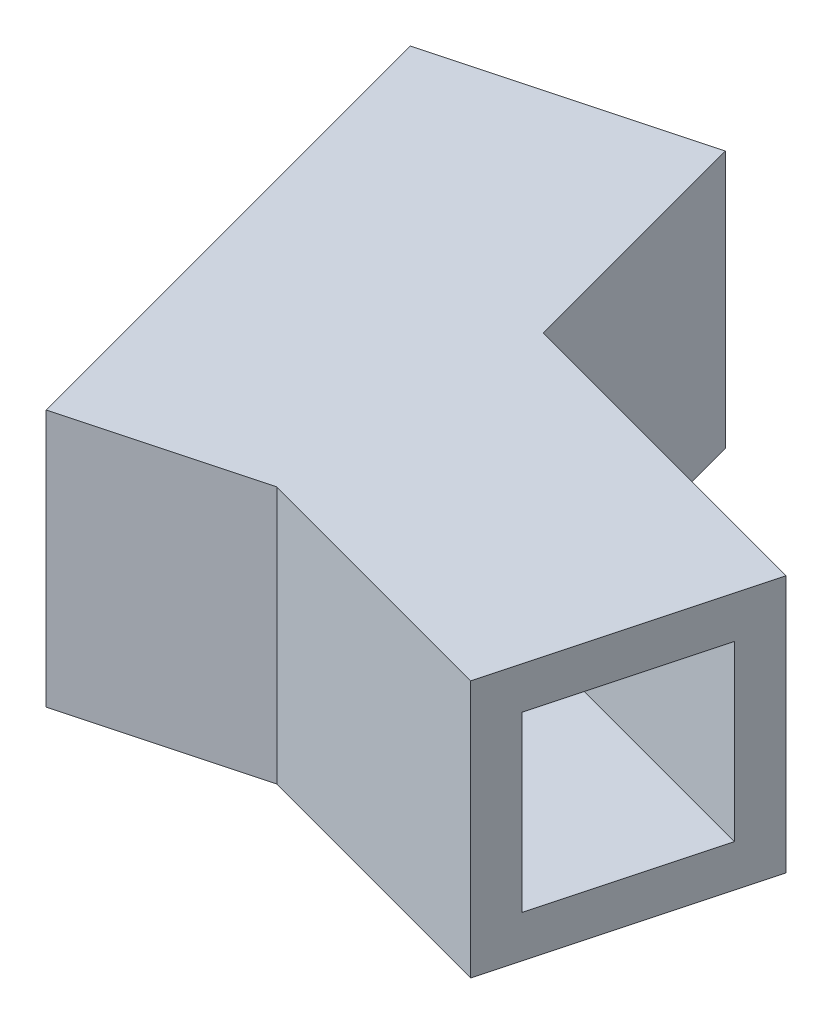
ISO-10303-21;
HEADER;
FILE_DESCRIPTION(('STEP AP214'),'2;1');
FILE_NAME('part.step','',(''),(''),'','','');
FILE_SCHEMA(('AUTOMOTIVE_DESIGN { 1 0 10303 214 1 1 1 1 }'));
ENDSEC;
DATA;
#1=APPLICATION_CONTEXT('core data for automotive mechanical design processes');
#2=APPLICATION_PROTOCOL_DEFINITION('international standard','automotive_design',2000,#1);
#3=PRODUCT_CONTEXT('',#1,'mechanical');
#4=PRODUCT('Part','Part','',(#3));
#5=PRODUCT_RELATED_PRODUCT_CATEGORY('part','',(#4));
#6=PRODUCT_DEFINITION_FORMATION('','',#4);
#7=PRODUCT_DEFINITION_CONTEXT('part definition',#1,'design');
#8=PRODUCT_DEFINITION('design','',#6,#7);
#9=PRODUCT_DEFINITION_SHAPE('','',#8);
#10=(LENGTH_UNIT() NAMED_UNIT(*) SI_UNIT(.MILLI.,.METRE.));
#11=(NAMED_UNIT(*) PLANE_ANGLE_UNIT() SI_UNIT($,.RADIAN.));
#12=(NAMED_UNIT(*) SI_UNIT($,.STERADIAN.) SOLID_ANGLE_UNIT());
#13=UNCERTAINTY_MEASURE_WITH_UNIT(LENGTH_MEASURE(1.E-05),#10,'distance_accuracy_value','');
#14=(GEOMETRIC_REPRESENTATION_CONTEXT(3) GLOBAL_UNCERTAINTY_ASSIGNED_CONTEXT((#13)) GLOBAL_UNIT_ASSIGNED_CONTEXT((#10,
#11,#12)) REPRESENTATION_CONTEXT('',''));
#15=CARTESIAN_POINT('',(0.,0.,0.));
#16=DIRECTION('',(0.,0.,1.));
#17=DIRECTION('',(1.,0.,0.));
#18=AXIS2_PLACEMENT_3D('',#15,#16,#17);
#19=CARTESIAN_POINT('',(-3.88228567653782,15.,-30.0180301004873));
#20=DIRECTION('',(0.258819045102521,0.,0.965925826289068));
#21=DIRECTION('',(0.965925826289068,0.,-0.258819045102521));
#22=AXIS2_PLACEMENT_3D('',#19,#20,#21);
#23=PLANE('',#22);
#24=DIRECTION('',(0.965925826289068,0.,-0.258819045102521));
#25=VECTOR('',#24,1.);
#26=CARTESIAN_POINT('',(-6.24880395094603,12.55,-29.3839234399861));
#27=LINE('',#26,#25);
#28=CARTESIAN_POINT('',(-16.0046547964656,12.55,-26.7698510844506));
#29=VERTEX_POINT('',#28);
#30=CARTESIAN_POINT('',(-6.24880395094603,12.55,-29.3839234399861));
#31=VERTEX_POINT('',#30);
#32=EDGE_CURVE('E284',#29,#31,#27,.T.);
#33=ORIENTED_EDGE('',*,*,#32,.F.);
#34=DIRECTION('',(0.,1.,0.));
#35=VECTOR('',#34,1.);
#36=CARTESIAN_POINT('',(-16.0046547964656,12.55,-26.7698510844506));
#37=LINE('',#36,#35);
#38=CARTESIAN_POINT('',(-16.0046547964656,2.45,-26.7698510844506));
#39=VERTEX_POINT('',#38);
#40=EDGE_CURVE('E263',#39,#29,#37,.T.);
#41=ORIENTED_EDGE('',*,*,#40,.F.);
#42=DIRECTION('',(-0.965925826289068,0.,0.258819045102521));
#43=VECTOR('',#42,1.);
#44=CARTESIAN_POINT('',(-6.24880395094603,2.45,-29.3839234399861));
#45=LINE('',#44,#43);
#46=CARTESIAN_POINT('',(-6.24880395094603,2.45,-29.3839234399861));
#47=VERTEX_POINT('',#46);
#48=EDGE_CURVE('E290',#47,#39,#45,.T.);
#49=ORIENTED_EDGE('',*,*,#48,.F.);
#50=DIRECTION('',(0.,-1.,0.));
#51=VECTOR('',#50,1.);
#52=CARTESIAN_POINT('',(-6.24880395094603,12.55,-29.3839234399861));
#53=LINE('',#52,#51);
#54=EDGE_CURVE('E287',#31,#47,#53,.T.);
#55=ORIENTED_EDGE('',*,*,#54,.F.);
#56=EDGE_LOOP('',(#33,#41,#49,#55));
#57=FACE_BOUND('',#56,.T.);
#58=DIRECTION('',(-0.965925826289068,0.,0.258819045102521));
#59=VECTOR('',#58,1.);
#60=CARTESIAN_POINT('',(-3.88228567653782,0.,-30.0180301004873));
#61=LINE('',#60,#59);
#62=CARTESIAN_POINT('',(-3.88228567653782,0.,-30.0180301004873));
#63=VERTEX_POINT('',#62);
#64=CARTESIAN_POINT('',(-18.3711730708738,0.,-26.1357444239495));
#65=VERTEX_POINT('',#64);
#66=EDGE_CURVE('E327',#63,#65,#61,.T.);
#67=ORIENTED_EDGE('',*,*,#66,.T.);
#68=DIRECTION('',(0.,-1.,0.));
#69=VECTOR('',#68,1.);
#70=CARTESIAN_POINT('',(-18.3711730708738,15.,-26.1357444239495));
#71=LINE('',#70,#69);
#72=CARTESIAN_POINT('',(-18.3711730708738,15.,-26.1357444239495));
#73=VERTEX_POINT('',#72);
#74=EDGE_CURVE('E381',#73,#65,#71,.T.);
#75=ORIENTED_EDGE('',*,*,#74,.F.);
#76=DIRECTION('',(-0.965925826289068,0.,0.258819045102521));
#77=VECTOR('',#76,1.);
#78=CARTESIAN_POINT('',(-3.88228567653782,15.,-30.0180301004873));
#79=LINE('',#78,#77);
#80=CARTESIAN_POINT('',(-3.88228567653782,15.,-30.0180301004873));
#81=VERTEX_POINT('',#80);
#82=EDGE_CURVE('E334',#81,#73,#79,.T.);
#83=ORIENTED_EDGE('',*,*,#82,.F.);
#84=DIRECTION('',(0.,-1.,0.));
#85=VECTOR('',#84,1.);
#86=CARTESIAN_POINT('',(-3.88228567653782,15.,-30.0180301004873));
#87=LINE('',#86,#85);
#88=EDGE_CURVE('E350',#81,#63,#87,.T.);
#89=ORIENTED_EDGE('',*,*,#88,.T.);
#90=EDGE_LOOP('',(#67,#75,#83,#89));
#91=FACE_BOUND('',#90,.T.);
#92=ADVANCED_FACE('F36',(#57,#91),#23,.F.);
#93=CARTESIAN_POINT('',(-18.3711730708738,15.,-26.1357444239495));
#94=DIRECTION('',(0.965925826289068,0.,-0.258819045102522));
#95=DIRECTION('',(-0.258819045102522,0.,-0.965925826289068));
#96=AXIS2_PLACEMENT_3D('',#93,#94,#95);
#97=PLANE('',#96);
#98=DIRECTION('',(0.258819045102522,0.,0.965925826289068));
#99=VECTOR('',#98,1.);
#100=CARTESIAN_POINT('',(-18.3711730708738,0.,-26.1357444239495));
#101=LINE('',#100,#99);
#102=CARTESIAN_POINT('',(-10.6066017177982,0.,2.84203036472259));
#103=VERTEX_POINT('',#102);
#104=EDGE_CURVE('E353',#65,#103,#101,.T.);
#105=ORIENTED_EDGE('',*,*,#104,.T.);
#106=DIRECTION('',(0.,-1.,0.));
#107=VECTOR('',#106,1.);
#108=CARTESIAN_POINT('',(-10.6066017177982,15.,2.84203036472259));
#109=LINE('',#108,#107);
#110=CARTESIAN_POINT('',(-10.6066017177982,15.,2.84203036472259));
#111=VERTEX_POINT('',#110);
#112=EDGE_CURVE('E378',#111,#103,#109,.T.);
#113=ORIENTED_EDGE('',*,*,#112,.F.);
#114=DIRECTION('',(0.258819045102522,0.,0.965925826289068));
#115=VECTOR('',#114,1.);
#116=CARTESIAN_POINT('',(-18.3711730708738,15.,-26.1357444239495));
#117=LINE('',#116,#115);
#118=EDGE_CURVE('E337',#73,#111,#117,.T.);
#119=ORIENTED_EDGE('',*,*,#118,.F.);
#120=ORIENTED_EDGE('',*,*,#74,.T.);
#121=EDGE_LOOP('',(#105,#113,#119,#120));
#122=FACE_BOUND('',#121,.T.);
#123=ADVANCED_FACE('F469',(#122),#97,.F.);
#124=CARTESIAN_POINT('',(-10.6066017177982,15.,2.84203036472259));
#125=DIRECTION('',(-0.258819045102521,0.,-0.965925826289068));
#126=DIRECTION('',(-0.965925826289068,0.,0.258819045102521));
#127=AXIS2_PLACEMENT_3D('',#124,#125,#126);
#128=PLANE('',#127);
#129=DIRECTION('',(0.965925826289068,0.,-0.258819045102521));
#130=VECTOR('',#129,1.);
#131=CARTESIAN_POINT('',(-10.6066017177982,0.,2.84203036472259));
#132=LINE('',#131,#130);
#133=CARTESIAN_POINT('',(0.,0.,0.));
#134=VERTEX_POINT('',#133);
#135=EDGE_CURVE('E355',#103,#134,#132,.T.);
#136=ORIENTED_EDGE('',*,*,#135,.T.);
#137=DIRECTION('',(0.,-1.,0.));
#138=VECTOR('',#137,1.);
#139=CARTESIAN_POINT('',(0.,15.,0.));
#140=LINE('',#139,#138);
#141=CARTESIAN_POINT('',(0.,15.,0.));
#142=VERTEX_POINT('',#141);
#143=EDGE_CURVE('E375',#142,#134,#140,.T.);
#144=ORIENTED_EDGE('',*,*,#143,.F.);
#145=DIRECTION('',(0.965925826289068,0.,-0.258819045102521));
#146=VECTOR('',#145,1.);
#147=CARTESIAN_POINT('',(-10.6066017177982,15.,2.84203036472259));
#148=LINE('',#147,#146);
#149=EDGE_CURVE('E340',#111,#142,#148,.T.);
#150=ORIENTED_EDGE('',*,*,#149,.F.);
#151=ORIENTED_EDGE('',*,*,#112,.T.);
#152=EDGE_LOOP('',(#136,#144,#150,#151));
#153=FACE_BOUND('',#152,.T.);
#154=ADVANCED_FACE('F475',(#153),#128,.F.);
#155=CARTESIAN_POINT('',(0.,15.,0.));
#156=DIRECTION('',(0.258819045102521,0.,-0.965925826289068));
#157=DIRECTION('',(-0.965925826289068,0.,-0.258819045102521));
#158=AXIS2_PLACEMENT_3D('',#155,#156,#157);
#159=PLANE('',#158);
#160=DIRECTION('',(0.965925826289068,0.,0.258819045102521));
#161=VECTOR('',#160,1.);
#162=CARTESIAN_POINT('',(0.,0.,0.));
#163=LINE('',#162,#161);
#164=CARTESIAN_POINT('',(15.4362308492435,0.,4.1361255902352));
#165=VERTEX_POINT('',#164);
#166=EDGE_CURVE('E357',#134,#165,#163,.T.);
#167=ORIENTED_EDGE('',*,*,#166,.T.);
#168=DIRECTION('',(0.,-1.,0.));
#169=VECTOR('',#168,1.);
#170=CARTESIAN_POINT('',(15.4362308492435,15.,4.1361255902352));
#171=LINE('',#170,#169);
#172=CARTESIAN_POINT('',(15.4362308492435,15.,4.1361255902352));
#173=VERTEX_POINT('',#172);
#174=EDGE_CURVE('E372',#173,#165,#171,.T.);
#175=ORIENTED_EDGE('',*,*,#174,.F.);
#176=DIRECTION('',(0.965925826289068,0.,0.258819045102521));
#177=VECTOR('',#176,1.);
#178=CARTESIAN_POINT('',(0.,15.,0.));
#179=LINE('',#178,#177);
#180=EDGE_CURVE('E342',#142,#173,#179,.T.);
#181=ORIENTED_EDGE('',*,*,#180,.F.);
#182=ORIENTED_EDGE('',*,*,#143,.T.);
#183=EDGE_LOOP('',(#167,#175,#181,#182));
#184=FACE_BOUND('',#183,.T.);
#185=ADVANCED_FACE('F721',(#184),#159,.F.);
#186=CARTESIAN_POINT('',(15.4362308492435,15.,4.1361255902352));
#187=DIRECTION('',(-0.965925826289068,0.,-0.258819045102521));
#188=DIRECTION('',(-0.258819045102521,0.,0.965925826289068));
#189=AXIS2_PLACEMENT_3D('',#186,#187,#188);
#190=PLANE('',#189);
#191=DIRECTION('',(-0.258819045102522,0.,0.965925826289068));
#192=VECTOR('',#191,1.);
#193=CARTESIAN_POINT('',(16.0703375097447,12.55,1.76960731582699));
#194=LINE('',#193,#192);
#195=CARTESIAN_POINT('',(18.6844098652802,12.55,-7.98624352969259));
#196=VERTEX_POINT('',#195);
#197=CARTESIAN_POINT('',(16.0703375097447,12.55,1.76960731582699));
#198=VERTEX_POINT('',#197);
#199=EDGE_CURVE('E317',#196,#198,#194,.T.);
#200=ORIENTED_EDGE('',*,*,#199,.F.);
#201=DIRECTION('',(0.,1.,0.));
#202=VECTOR('',#201,1.);
#203=CARTESIAN_POINT('',(18.6844098652802,2.45,-7.9862435296926));
#204=LINE('',#203,#202);
#205=CARTESIAN_POINT('',(18.6844098652802,2.45,-7.9862435296926));
#206=VERTEX_POINT('',#205);
#207=EDGE_CURVE('E295',#206,#196,#204,.T.);
#208=ORIENTED_EDGE('',*,*,#207,.F.);
#209=DIRECTION('',(0.258819045102522,0.,-0.965925826289068));
#210=VECTOR('',#209,1.);
#211=CARTESIAN_POINT('',(16.0703375097447,2.45,1.76960731582699));
#212=LINE('',#211,#210);
#213=CARTESIAN_POINT('',(16.0703375097447,2.45,1.76960731582699));
#214=VERTEX_POINT('',#213);
#215=EDGE_CURVE('E306',#214,#206,#212,.T.);
#216=ORIENTED_EDGE('',*,*,#215,.F.);
#217=DIRECTION('',(0.,-1.,0.));
#218=VECTOR('',#217,1.);
#219=CARTESIAN_POINT('',(16.0703375097447,2.45,1.76960731582699));
#220=LINE('',#219,#218);
#221=EDGE_CURVE('E320',#198,#214,#220,.T.);
#222=ORIENTED_EDGE('',*,*,#221,.F.);
#223=EDGE_LOOP('',(#200,#208,#216,#222));
#224=FACE_BOUND('',#223,.T.);
#225=DIRECTION('',(0.258819045102521,0.,-0.965925826289068));
#226=VECTOR('',#225,1.);
#227=CARTESIAN_POINT('',(15.4362308492435,0.,4.1361255902352));
#228=LINE('',#227,#226);
#229=CARTESIAN_POINT('',(19.3185165257814,0.,-10.3527618041008));
#230=VERTEX_POINT('',#229);
#231=EDGE_CURVE('E359',#165,#230,#228,.T.);
#232=ORIENTED_EDGE('',*,*,#231,.T.);
#233=DIRECTION('',(0.,-1.,0.));
#234=VECTOR('',#233,1.);
#235=CARTESIAN_POINT('',(19.3185165257814,15.,-10.3527618041008));
#236=LINE('',#235,#234);
#237=CARTESIAN_POINT('',(19.3185165257814,15.,-10.3527618041008));
#238=VERTEX_POINT('',#237);
#239=EDGE_CURVE('E369',#238,#230,#236,.T.);
#240=ORIENTED_EDGE('',*,*,#239,.F.);
#241=DIRECTION('',(0.258819045102521,0.,-0.965925826289068));
#242=VECTOR('',#241,1.);
#243=CARTESIAN_POINT('',(15.4362308492435,15.,4.1361255902352));
#244=LINE('',#243,#242);
#245=EDGE_CURVE('E344',#173,#238,#244,.T.);
#246=ORIENTED_EDGE('',*,*,#245,.F.);
#247=ORIENTED_EDGE('',*,*,#174,.T.);
#248=EDGE_LOOP('',(#232,#240,#246,#247));
#249=FACE_BOUND('',#248,.T.);
#250=ADVANCED_FACE('F713',(#224,#249),#190,.F.);
#251=CARTESIAN_POINT('',(19.3185165257814,15.,-10.3527618041008));
#252=DIRECTION('',(-0.258819045102521,0.,0.965925826289068));
#253=DIRECTION('',(0.965925826289068,0.,0.258819045102521));
#254=AXIS2_PLACEMENT_3D('',#251,#252,#253);
#255=PLANE('',#254);
#256=DIRECTION('',(-0.965925826289068,0.,-0.258819045102522));
#257=VECTOR('',#256,1.);
#258=CARTESIAN_POINT('',(19.3185165257814,0.,-10.3527618041008));
#259=LINE('',#258,#257);
#260=CARTESIAN_POINT('',(0.,0.,-15.5291427061513));
#261=VERTEX_POINT('',#260);
#262=EDGE_CURVE('E361',#230,#261,#259,.T.);
#263=ORIENTED_EDGE('',*,*,#262,.T.);
#264=DIRECTION('',(0.,-1.,0.));
#265=VECTOR('',#264,1.);
#266=CARTESIAN_POINT('',(0.,15.,-15.5291427061513));
#267=LINE('',#266,#265);
#268=CARTESIAN_POINT('',(0.,15.,-15.5291427061513));
#269=VERTEX_POINT('',#268);
#270=EDGE_CURVE('E366',#269,#261,#267,.T.);
#271=ORIENTED_EDGE('',*,*,#270,.F.);
#272=DIRECTION('',(-0.965925826289068,0.,-0.258819045102522));
#273=VECTOR('',#272,1.);
#274=CARTESIAN_POINT('',(19.3185165257814,15.,-10.3527618041008));
#275=LINE('',#274,#273);
#276=EDGE_CURVE('E346',#238,#269,#275,.T.);
#277=ORIENTED_EDGE('',*,*,#276,.F.);
#278=ORIENTED_EDGE('',*,*,#239,.T.);
#279=EDGE_LOOP('',(#263,#271,#277,#278));
#280=FACE_BOUND('',#279,.T.);
#281=ADVANCED_FACE('F705',(#280),#255,.F.);
#282=CARTESIAN_POINT('',(0.,15.,-15.5291427061513));
#283=DIRECTION('',(-0.965925826289068,0.,0.258819045102521));
#284=DIRECTION('',(0.258819045102521,0.,0.965925826289068));
#285=AXIS2_PLACEMENT_3D('',#282,#283,#284);
#286=PLANE('',#285);
#287=DIRECTION('',(-0.258819045102521,0.,-0.965925826289068));
#288=VECTOR('',#287,1.);
#289=CARTESIAN_POINT('',(0.,0.,-15.5291427061513));
#290=LINE('',#289,#288);
#291=EDGE_CURVE('E338',#261,#63,#290,.T.);
#292=ORIENTED_EDGE('',*,*,#291,.T.);
#293=ORIENTED_EDGE('',*,*,#88,.F.);
#294=DIRECTION('',(-0.258819045102521,0.,-0.965925826289068));
#295=VECTOR('',#294,1.);
#296=CARTESIAN_POINT('',(0.,15.,-15.5291427061513));
#297=LINE('',#296,#295);
#298=EDGE_CURVE('E348',#269,#81,#297,.T.);
#299=ORIENTED_EDGE('',*,*,#298,.F.);
#300=ORIENTED_EDGE('',*,*,#270,.T.);
#301=EDGE_LOOP('',(#292,#293,#299,#300));
#302=FACE_BOUND('',#301,.T.);
#303=ADVANCED_FACE('F697',(#302),#286,.F.);
#304=CARTESIAN_POINT('',(0.,15.,0.));
#305=DIRECTION('',(0.,1.,0.));
#306=DIRECTION('',(0.,0.,1.));
#307=AXIS2_PLACEMENT_3D('',#304,#305,#306);
#308=PLANE('',#307);
#309=ORIENTED_EDGE('',*,*,#82,.T.);
#310=ORIENTED_EDGE('',*,*,#118,.T.);
#311=ORIENTED_EDGE('',*,*,#149,.T.);
#312=ORIENTED_EDGE('',*,*,#180,.T.);
#313=ORIENTED_EDGE('',*,*,#245,.T.);
#314=ORIENTED_EDGE('',*,*,#276,.T.);
#315=ORIENTED_EDGE('',*,*,#298,.T.);
#316=EDGE_LOOP('',(#309,#310,#311,#312,#313,#314,#315));
#317=FACE_BOUND('',#316,.T.);
#318=ADVANCED_FACE('F689',(#317),#308,.T.);
#319=CARTESIAN_POINT('',(0.,0.,0.));
#320=DIRECTION('',(0.,1.,0.));
#321=DIRECTION('',(0.,0.,1.));
#322=AXIS2_PLACEMENT_3D('',#319,#320,#321);
#323=PLANE('',#322);
#324=ORIENTED_EDGE('',*,*,#66,.F.);
#325=ORIENTED_EDGE('',*,*,#291,.F.);
#326=ORIENTED_EDGE('',*,*,#262,.F.);
#327=ORIENTED_EDGE('',*,*,#231,.F.);
#328=ORIENTED_EDGE('',*,*,#166,.F.);
#329=ORIENTED_EDGE('',*,*,#135,.F.);
#330=ORIENTED_EDGE('',*,*,#104,.F.);
#331=EDGE_LOOP('',(#324,#325,#326,#327,#328,#329,#330));
#332=FACE_BOUND('',#331,.T.);
#333=ADVANCED_FACE('F680',(#332),#323,.F.);
#334=CARTESIAN_POINT('',(1.29774499207696,2.45,-12.644986341538));
#335=DIRECTION('',(0.258819045102521,0.,-0.965925826289068));
#336=DIRECTION('',(-0.965925826289068,0.,-0.258819045102521));
#337=AXIS2_PLACEMENT_3D('',#334,#335,#336);
#338=PLANE('',#337);
#339=ORIENTED_EDGE('',*,*,#207,.T.);
#340=DIRECTION('',(0.965925826289068,0.,0.258819045102521));
#341=VECTOR('',#340,1.);
#342=CARTESIAN_POINT('',(1.29774499207696,12.55,-12.644986341538));
#343=LINE('',#342,#341);
#344=CARTESIAN_POINT('',(1.29774499207696,12.55,-12.644986341538));
#345=VERTEX_POINT('',#344);
#346=EDGE_CURVE('E315',#345,#196,#343,.T.);
#347=ORIENTED_EDGE('',*,*,#346,.F.);
#348=DIRECTION('',(0.,1.,0.));
#349=VECTOR('',#348,1.);
#350=CARTESIAN_POINT('',(1.29774499207696,2.45,-12.644986341538));
#351=LINE('',#350,#349);
#352=CARTESIAN_POINT('',(1.29774499207696,2.45,-12.644986341538));
#353=VERTEX_POINT('',#352);
#354=EDGE_CURVE('E302',#353,#345,#351,.T.);
#355=ORIENTED_EDGE('',*,*,#354,.F.);
#356=DIRECTION('',(0.965925826289068,0.,0.258819045102521));
#357=VECTOR('',#356,1.);
#358=CARTESIAN_POINT('',(1.29774499207696,2.45,-12.644986341538));
#359=LINE('',#358,#357);
#360=EDGE_CURVE('E325',#353,#206,#359,.T.);
#361=ORIENTED_EDGE('',*,*,#360,.T.);
#362=EDGE_LOOP('',(#339,#347,#355,#361));
#363=FACE_BOUND('',#362,.T.);
#364=ADVANCED_FACE('F672',(#363),#338,.F.);
#365=CARTESIAN_POINT('',(-1.31632736345851,2.45,-2.8891354960184));
#366=DIRECTION('',(0.,-1.,0.));
#367=DIRECTION('',(0.,0.,-1.));
#368=AXIS2_PLACEMENT_3D('',#365,#366,#367);
#369=PLANE('',#368);
#370=ORIENTED_EDGE('',*,*,#215,.T.);
#371=ORIENTED_EDGE('',*,*,#360,.F.);
#372=DIRECTION('',(0.258819045102522,0.,-0.965925826289068));
#373=VECTOR('',#372,1.);
#374=CARTESIAN_POINT('',(-1.31632736345851,2.45,-2.8891354960184));
#375=LINE('',#374,#373);
#376=CARTESIAN_POINT('',(-1.31632736345851,2.45,-2.8891354960184));
#377=VERTEX_POINT('',#376);
#378=EDGE_CURVE('E312',#377,#353,#375,.T.);
#379=ORIENTED_EDGE('',*,*,#378,.F.);
#380=DIRECTION('',(0.965925826289068,0.,0.258819045102521));
#381=VECTOR('',#380,1.);
#382=CARTESIAN_POINT('',(-1.31632736345851,2.45,-2.8891354960184));
#383=LINE('',#382,#381);
#384=EDGE_CURVE('E328',#377,#214,#383,.T.);
#385=ORIENTED_EDGE('',*,*,#384,.T.);
#386=EDGE_LOOP('',(#370,#371,#379,#385));
#387=FACE_BOUND('',#386,.T.);
#388=ADVANCED_FACE('F664',(#387),#369,.F.);
#389=CARTESIAN_POINT('',(-1.31632736345851,2.45,-2.8891354960184));
#390=DIRECTION('',(-0.258819045102521,0.,0.965925826289068));
#391=DIRECTION('',(0.965925826289068,0.,0.258819045102521));
#392=AXIS2_PLACEMENT_3D('',#389,#390,#391);
#393=PLANE('',#392);
#394=ORIENTED_EDGE('',*,*,#221,.T.);
#395=ORIENTED_EDGE('',*,*,#384,.F.);
#396=DIRECTION('',(0.,-1.,0.));
#397=VECTOR('',#396,1.);
#398=CARTESIAN_POINT('',(-1.31632736345851,2.45,-2.8891354960184));
#399=LINE('',#398,#397);
#400=CARTESIAN_POINT('',(-1.31632736345851,12.55,-2.8891354960184));
#401=VERTEX_POINT('',#400);
#402=EDGE_CURVE('E309',#401,#377,#399,.T.);
#403=ORIENTED_EDGE('',*,*,#402,.F.);
#404=DIRECTION('',(0.965925826289068,0.,0.258819045102521));
#405=VECTOR('',#404,1.);
#406=CARTESIAN_POINT('',(-1.31632736345851,12.55,-2.8891354960184));
#407=LINE('',#406,#405);
#408=EDGE_CURVE('E330',#401,#198,#407,.T.);
#409=ORIENTED_EDGE('',*,*,#408,.T.);
#410=EDGE_LOOP('',(#394,#395,#403,#409));
#411=FACE_BOUND('',#410,.T.);
#412=ADVANCED_FACE('F656',(#411),#393,.F.);
#413=CARTESIAN_POINT('',(-1.31632736345851,12.55,-2.8891354960184));
#414=DIRECTION('',(0.,1.,0.));
#415=DIRECTION('',(0.,0.,1.));
#416=AXIS2_PLACEMENT_3D('',#413,#414,#415);
#417=PLANE('',#416);
#418=ORIENTED_EDGE('',*,*,#199,.T.);
#419=ORIENTED_EDGE('',*,*,#408,.F.);
#420=DIRECTION('',(-0.258819045102522,0.,0.965925826289068));
#421=VECTOR('',#420,1.);
#422=CARTESIAN_POINT('',(-1.31632736345851,12.55,-2.8891354960184));
#423=LINE('',#422,#421);
#424=EDGE_CURVE('E305',#345,#401,#423,.T.);
#425=ORIENTED_EDGE('',*,*,#424,.F.);
#426=ORIENTED_EDGE('',*,*,#346,.T.);
#427=EDGE_LOOP('',(#418,#419,#425,#426));
#428=FACE_BOUND('',#427,.T.);
#429=ADVANCED_FACE('F649',(#428),#417,.F.);
#430=CARTESIAN_POINT('',(-1.95043402395969,0.,-0.522617221610183));
#431=DIRECTION('',(-0.965925826289068,0.,-0.258819045102522));
#432=DIRECTION('',(-0.258819045102522,0.,0.965925826289068));
#433=AXIS2_PLACEMENT_3D('',#430,#431,#432);
#434=PLANE('',#433);
#435=DIRECTION('',(0.,1.,0.));
#436=VECTOR('',#435,1.);
#437=CARTESIAN_POINT('',(1.02598499471931,3.5,-11.6307642239345));
#438=LINE('',#437,#436);
#439=CARTESIAN_POINT('',(1.02598499471931,6.5,-11.6307642239345));
#440=VERTEX_POINT('',#439);
#441=CARTESIAN_POINT('',(1.02598499471931,8.49999999999999,-11.6307642239345));
#442=VERTEX_POINT('',#441);
#443=EDGE_CURVE('E264',#440,#442,#438,.T.);
#444=ORIENTED_EDGE('',*,*,#443,.F.);
#445=CARTESIAN_POINT('',(0.249527859411743,6.5,-8.73298674506726));
#446=DIRECTION('',(-0.965925826289068,0.,-0.258819045102522));
#447=DIRECTION('',(-0.258819045102522,0.,0.965925826289068));
#448=AXIS2_PLACEMENT_3D('',#445,#446,#447);
#449=CIRCLE('',#448,3.);
#450=CARTESIAN_POINT('',(0.249527859411743,3.5,-8.73298674506726));
#451=VERTEX_POINT('',#450);
#452=EDGE_CURVE('E61',#440,#451,#449,.T.);
#453=ORIENTED_EDGE('',*,*,#452,.T.);
#454=DIRECTION('',(0.258819045102522,0.,-0.965925826289068));
#455=VECTOR('',#454,1.);
#456=CARTESIAN_POINT('',(1.02598499471931,3.5,-11.6307642239345));
#457=LINE('',#456,#455);
#458=CARTESIAN_POINT('',(-0.268110230793301,3.5,-6.80113509248912));
#459=VERTEX_POINT('',#458);
#460=EDGE_CURVE('E266',#459,#451,#457,.T.);
#461=ORIENTED_EDGE('',*,*,#460,.F.);
#462=CARTESIAN_POINT('',(-0.2681102307933,6.5,-6.80113509248912));
#463=DIRECTION('',(-0.965925826289068,0.,-0.258819045102522));
#464=DIRECTION('',(-0.258819045102522,0.,0.965925826289068));
#465=AXIS2_PLACEMENT_3D('',#462,#463,#464);
#466=CIRCLE('',#465,3.);
#467=CARTESIAN_POINT('',(-1.04456736610087,6.5,-3.90335761362192));
#468=VERTEX_POINT('',#467);
#469=EDGE_CURVE('E11',#459,#468,#466,.T.);
#470=ORIENTED_EDGE('',*,*,#469,.T.);
#471=DIRECTION('',(0.,-1.,0.));
#472=VECTOR('',#471,1.);
#473=CARTESIAN_POINT('',(-1.04456736610087,3.5,-3.90335761362192));
#474=LINE('',#473,#472);
#475=CARTESIAN_POINT('',(-1.04456736610087,8.49999999999999,-3.90335761362192));
#476=VERTEX_POINT('',#475);
#477=EDGE_CURVE('E259',#476,#468,#474,.T.);
#478=ORIENTED_EDGE('',*,*,#477,.F.);
#479=CARTESIAN_POINT('',(-0.2681102307933,8.49999999999999,-6.80113509248912));
#480=DIRECTION('',(-0.965925826289068,0.,-0.258819045102522));
#481=DIRECTION('',(-0.258819045102522,0.,0.965925826289068));
#482=AXIS2_PLACEMENT_3D('',#479,#480,#481);
#483=CIRCLE('',#482,3.);
#484=CARTESIAN_POINT('',(-0.268110230793301,11.5,-6.80113509248912));
#485=VERTEX_POINT('',#484);
#486=EDGE_CURVE('E428',#476,#485,#483,.T.);
#487=ORIENTED_EDGE('',*,*,#486,.T.);
#488=DIRECTION('',(-0.258819045102522,0.,0.965925826289068));
#489=VECTOR('',#488,1.);
#490=CARTESIAN_POINT('',(1.02598499471931,11.5,-11.6307642239345));
#491=LINE('',#490,#489);
#492=CARTESIAN_POINT('',(0.249527859411742,11.5,-8.73298674506726));
#493=VERTEX_POINT('',#492);
#494=EDGE_CURVE('E260',#493,#485,#491,.T.);
#495=ORIENTED_EDGE('',*,*,#494,.F.);
#496=CARTESIAN_POINT('',(0.249527859411743,8.49999999999999,-8.73298674506726));
#497=DIRECTION('',(-0.965925826289068,0.,-0.258819045102522));
#498=DIRECTION('',(-0.258819045102522,0.,0.965925826289068));
#499=AXIS2_PLACEMENT_3D('',#496,#497,#498);
#500=CIRCLE('',#499,3.);
#501=EDGE_CURVE('E53',#493,#442,#500,.T.);
#502=ORIENTED_EDGE('',*,*,#501,.T.);
#503=EDGE_LOOP('',(#444,#453,#461,#470,#478,#487,#495,#502));
#504=FACE_BOUND('',#503,.T.);
#505=ORIENTED_EDGE('',*,*,#354,.T.);
#506=ORIENTED_EDGE('',*,*,#424,.T.);
#507=ORIENTED_EDGE('',*,*,#402,.T.);
#508=ORIENTED_EDGE('',*,*,#378,.T.);
#509=EDGE_LOOP('',(#505,#506,#507,#508));
#510=FACE_BOUND('',#509,.T.);
#511=ADVANCED_FACE('F452',(#504,#510),#434,.F.);
#512=CARTESIAN_POINT('',(-11.6047310297228,12.55,-10.3491120375365));
#513=DIRECTION('',(-0.965925826289068,0.,0.258819045102521));
#514=DIRECTION('',(0.258819045102521,0.,0.965925826289068));
#515=AXIS2_PLACEMENT_3D('',#512,#513,#514);
#516=PLANE('',#515);
#517=DIRECTION('',(0.,1.,0.));
#518=VECTOR('',#517,1.);
#519=CARTESIAN_POINT('',(-11.6047310297228,12.55,-10.3491120375365));
#520=LINE('',#519,#518);
#521=CARTESIAN_POINT('',(-11.6047310297228,8.49999999999999,-10.3491120375365));
#522=VERTEX_POINT('',#521);
#523=CARTESIAN_POINT('',(-11.6047310297228,12.55,-10.3491120375365));
#524=VERTEX_POINT('',#523);
#525=EDGE_CURVE('E273',#522,#524,#520,.T.);
#526=ORIENTED_EDGE('',*,*,#525,.F.);
#527=DIRECTION('',(0.258819045102521,0.,0.965925826289068));
#528=VECTOR('',#527,1.);
#529=CARTESIAN_POINT('',(-11.4574089780698,8.49999999999999,-9.79929865569244));
#530=LINE('',#529,#528);
#531=CARTESIAN_POINT('',(-11.4574089780698,8.49999999999999,-9.79929865569244));
#532=VERTEX_POINT('',#531);
#533=EDGE_CURVE('E393',#522,#532,#530,.T.);
#534=ORIENTED_EDGE('',*,*,#533,.T.);
#535=DIRECTION('',(0.,-1.,0.));
#536=VECTOR('',#535,1.);
#537=CARTESIAN_POINT('',(-11.4574089780698,3.5,-9.79929865569244));
#538=LINE('',#537,#536);
#539=CARTESIAN_POINT('',(-11.4574089780698,6.5,-9.79929865569244));
#540=VERTEX_POINT('',#539);
#541=EDGE_CURVE('E234',#532,#540,#538,.T.);
#542=ORIENTED_EDGE('',*,*,#541,.T.);
#543=DIRECTION('',(-0.258819045102521,0.,-0.965925826289068));
#544=VECTOR('',#543,1.);
#545=CARTESIAN_POINT('',(-11.6047310297228,6.5,-10.3491120375365));
#546=LINE('',#545,#544);
#547=CARTESIAN_POINT('',(-11.6047310297228,6.5,-10.3491120375365));
#548=VERTEX_POINT('',#547);
#549=EDGE_CURVE('E390',#540,#548,#546,.T.);
#550=ORIENTED_EDGE('',*,*,#549,.T.);
#551=CARTESIAN_POINT('',(-11.6047310297228,2.45,-10.3491120375365));
#552=VERTEX_POINT('',#551);
#553=EDGE_CURVE('E270',#552,#548,#520,.T.);
#554=ORIENTED_EDGE('',*,*,#553,.F.);
#555=DIRECTION('',(-0.258819045102521,0.,-0.965925826289068));
#556=VECTOR('',#555,1.);
#557=CARTESIAN_POINT('',(-11.6047310297228,2.45,-10.3491120375365));
#558=LINE('',#557,#556);
#559=EDGE_CURVE('E293',#552,#39,#558,.T.);
#560=ORIENTED_EDGE('',*,*,#559,.T.);
#561=ORIENTED_EDGE('',*,*,#40,.T.);
#562=DIRECTION('',(-0.258819045102521,0.,-0.965925826289068));
#563=VECTOR('',#562,1.);
#564=CARTESIAN_POINT('',(-11.6047310297228,12.55,-10.3491120375365));
#565=LINE('',#564,#563);
#566=EDGE_CURVE('E282',#524,#29,#565,.T.);
#567=ORIENTED_EDGE('',*,*,#566,.F.);
#568=EDGE_LOOP('',(#526,#534,#542,#550,#554,#560,#561,#567));
#569=FACE_BOUND('',#568,.T.);
#570=ADVANCED_FACE('F637',(#569),#516,.F.);
#571=CARTESIAN_POINT('',(-1.84888018420317,2.45,-12.9631843930719));
#572=DIRECTION('',(0.,-1.,0.));
#573=DIRECTION('',(0.,0.,-1.));
#574=AXIS2_PLACEMENT_3D('',#571,#572,#573);
#575=PLANE('',#574);
#576=ORIENTED_EDGE('',*,*,#48,.T.);
#577=ORIENTED_EDGE('',*,*,#559,.F.);
#578=DIRECTION('',(-0.965925826289068,0.,0.258819045102521));
#579=VECTOR('',#578,1.);
#580=CARTESIAN_POINT('',(-1.84888018420317,2.45,-12.9631843930719));
#581=LINE('',#580,#579);
#582=CARTESIAN_POINT('',(-1.84888018420317,2.45,-12.9631843930719));
#583=VERTEX_POINT('',#582);
#584=EDGE_CURVE('E279',#583,#552,#581,.T.);
#585=ORIENTED_EDGE('',*,*,#584,.F.);
#586=DIRECTION('',(-0.258819045102521,0.,-0.965925826289068));
#587=VECTOR('',#586,1.);
#588=CARTESIAN_POINT('',(-1.84888018420317,2.45,-12.9631843930719));
#589=LINE('',#588,#587);
#590=EDGE_CURVE('E296',#583,#47,#589,.T.);
#591=ORIENTED_EDGE('',*,*,#590,.T.);
#592=EDGE_LOOP('',(#576,#577,#585,#591));
#593=FACE_BOUND('',#592,.T.);
#594=ADVANCED_FACE('F629',(#593),#575,.F.);
#595=CARTESIAN_POINT('',(-1.84888018420317,12.55,-12.9631843930719));
#596=DIRECTION('',(0.965925826289068,0.,-0.258819045102521));
#597=DIRECTION('',(-0.258819045102521,0.,-0.965925826289068));
#598=AXIS2_PLACEMENT_3D('',#595,#596,#597);
#599=PLANE('',#598);
#600=ORIENTED_EDGE('',*,*,#54,.T.);
#601=ORIENTED_EDGE('',*,*,#590,.F.);
#602=DIRECTION('',(0.,-1.,0.));
#603=VECTOR('',#602,1.);
#604=CARTESIAN_POINT('',(-1.84888018420317,12.55,-12.9631843930719));
#605=LINE('',#604,#603);
#606=CARTESIAN_POINT('',(-1.84888018420317,12.55,-12.9631843930719));
#607=VERTEX_POINT('',#606);
#608=EDGE_CURVE('E276',#607,#583,#605,.T.);
#609=ORIENTED_EDGE('',*,*,#608,.F.);
#610=DIRECTION('',(-0.258819045102521,0.,-0.965925826289068));
#611=VECTOR('',#610,1.);
#612=CARTESIAN_POINT('',(-1.84888018420317,12.55,-12.9631843930719));
#613=LINE('',#612,#611);
#614=EDGE_CURVE('E298',#607,#31,#613,.T.);
#615=ORIENTED_EDGE('',*,*,#614,.T.);
#616=EDGE_LOOP('',(#600,#601,#609,#615));
#617=FACE_BOUND('',#616,.T.);
#618=ADVANCED_FACE('F620',(#617),#599,.F.);
#619=CARTESIAN_POINT('',(-1.84888018420317,12.55,-12.9631843930719));
#620=DIRECTION('',(0.,1.,0.));
#621=DIRECTION('',(0.,0.,1.));
#622=AXIS2_PLACEMENT_3D('',#619,#620,#621);
#623=PLANE('',#622);
#624=ORIENTED_EDGE('',*,*,#32,.T.);
#625=ORIENTED_EDGE('',*,*,#614,.F.);
#626=DIRECTION('',(0.965925826289068,0.,-0.258819045102521));
#627=VECTOR('',#626,1.);
#628=CARTESIAN_POINT('',(-1.84888018420317,12.55,-12.9631843930719));
#629=LINE('',#628,#627);
#630=EDGE_CURVE('E272',#524,#607,#629,.T.);
#631=ORIENTED_EDGE('',*,*,#630,.F.);
#632=ORIENTED_EDGE('',*,*,#566,.T.);
#633=EDGE_LOOP('',(#624,#625,#631,#632));
#634=FACE_BOUND('',#633,.T.);
#635=ADVANCED_FACE('F612',(#634),#623,.F.);
#636=CARTESIAN_POINT('',(-3.36464758633278,0.,-12.5570357417579));
#637=DIRECTION('',(-0.258819045102521,0.,-0.965925826289068));
#638=DIRECTION('',(-0.965925826289068,0.,0.258819045102521));
#639=AXIS2_PLACEMENT_3D('',#636,#637,#638);
#640=PLANE('',#639);
#641=DIRECTION('',(0.,-1.,0.));
#642=VECTOR('',#641,1.);
#643=CARTESIAN_POINT('',(-2.8631023018067,3.5,-12.6914243957143));
#644=LINE('',#643,#642);
#645=CARTESIAN_POINT('',(-2.8631023018067,11.5,-12.6914243957143));
#646=VERTEX_POINT('',#645);
#647=CARTESIAN_POINT('',(-2.8631023018067,3.5,-12.6914243957143));
#648=VERTEX_POINT('',#647);
#649=EDGE_CURVE('E229',#646,#648,#644,.T.);
#650=ORIENTED_EDGE('',*,*,#649,.F.);
#651=DIRECTION('',(0.965925826289068,0.,-0.258819045102521));
#652=VECTOR('',#651,1.);
#653=CARTESIAN_POINT('',(-3.36464758633278,11.5,-12.5570357417579));
#654=LINE('',#653,#652);
#655=CARTESIAN_POINT('',(-8.70695355085556,11.5,-11.125569172844));
#656=VERTEX_POINT('',#655);
#657=EDGE_CURVE('E235',#656,#646,#654,.T.);
#658=ORIENTED_EDGE('',*,*,#657,.F.);
#659=CARTESIAN_POINT('',(-8.70695355085556,8.49999999999999,-11.125569172844));
#660=DIRECTION('',(-0.258819045102521,0.,-0.965925826289068));
#661=DIRECTION('',(-0.965925826289068,0.,0.258819045102521));
#662=AXIS2_PLACEMENT_3D('',#659,#660,#661);
#663=CIRCLE('',#662,3.);
#664=EDGE_CURVE('E424',#656,#522,#663,.F.);
#665=ORIENTED_EDGE('',*,*,#664,.T.);
#666=ORIENTED_EDGE('',*,*,#525,.T.);
#667=ORIENTED_EDGE('',*,*,#630,.T.);
#668=ORIENTED_EDGE('',*,*,#608,.T.);
#669=ORIENTED_EDGE('',*,*,#584,.T.);
#670=ORIENTED_EDGE('',*,*,#553,.T.);
#671=CARTESIAN_POINT('',(-8.70695355085556,6.5,-11.125569172844));
#672=DIRECTION('',(-0.258819045102521,0.,-0.965925826289068));
#673=DIRECTION('',(-0.965925826289068,0.,0.258819045102521));
#674=AXIS2_PLACEMENT_3D('',#671,#672,#673);
#675=CIRCLE('',#674,3.);
#676=CARTESIAN_POINT('',(-8.70695355085556,3.5,-11.125569172844));
#677=VERTEX_POINT('',#676);
#678=EDGE_CURVE('E231',#548,#677,#675,.F.);
#679=ORIENTED_EDGE('',*,*,#678,.T.);
#680=DIRECTION('',(-0.965925826289068,0.,0.258819045102521));
#681=VECTOR('',#680,1.);
#682=CARTESIAN_POINT('',(-3.36464758633278,3.5,-12.5570357417579));
#683=LINE('',#682,#681);
#684=EDGE_CURVE('E224',#648,#677,#683,.T.);
#685=ORIENTED_EDGE('',*,*,#684,.F.);
#686=EDGE_LOOP('',(#650,#658,#665,#666,#667,#668,#669,#670,#679,#685));
#687=FACE_BOUND('',#686,.T.);
#688=ADVANCED_FACE('F226',(#687),#640,.T.);
#689=CARTESIAN_POINT('',(-22.4944939802787,3.5,-17.9330575708784));
#690=DIRECTION('',(0.,-1.,0.));
#691=DIRECTION('',(0.,0.,-1.));
#692=AXIS2_PLACEMENT_3D('',#689,#690,#691);
#693=PLANE('',#692);
#694=ORIENTED_EDGE('',*,*,#460,.T.);
#695=DIRECTION('',(0.965925826289068,0.,0.258819045102521));
#696=VECTOR('',#695,1.);
#697=CARTESIAN_POINT('',(-3.6341951685546,3.5,-9.773627194037));
#698=LINE('',#697,#696);
#699=CARTESIAN_POINT('',(-1.96116256107898,3.5,-9.32533945795297));
#700=VERTEX_POINT('',#699);
#701=EDGE_CURVE('E241',#451,#700,#698,.F.);
#702=ORIENTED_EDGE('',*,*,#701,.T.);
#703=DIRECTION('',(-0.258819045102521,0.,-0.965925826289068));
#704=VECTOR('',#703,1.);
#705=CARTESIAN_POINT('',(2.09011344946833,3.5,5.79422844889452));
#706=LINE('',#705,#704);
#707=EDGE_CURVE('E238',#700,#648,#706,.T.);
#708=ORIENTED_EDGE('',*,*,#707,.T.);
#709=ORIENTED_EDGE('',*,*,#684,.T.);
#710=DIRECTION('',(-0.258819045102521,0.,-0.965925826289068));
#711=VECTOR('',#710,1.);
#712=CARTESIAN_POINT('',(-8.55963149920262,3.5,-10.575755791));
#713=LINE('',#712,#711);
#714=CARTESIAN_POINT('',(-8.55963149920262,3.5,-10.575755791));
#715=VERTEX_POINT('',#714);
#716=EDGE_CURVE('E409',#677,#715,#713,.F.);
#717=ORIENTED_EDGE('',*,*,#716,.T.);
#718=CARTESIAN_POINT('',(-5.66185402033542,3.5,-11.3522129263076));
#719=DIRECTION('',(0.,-1.,0.));
#720=DIRECTION('',(0.,0.,-1.));
#721=AXIS2_PLACEMENT_3D('',#718,#719,#720);
#722=CIRCLE('',#721,3.);
#723=CARTESIAN_POINT('',(-6.43831115564298,3.5,-8.45443544744037));
#724=VERTEX_POINT('',#723);
#725=EDGE_CURVE('E407',#715,#724,#722,.F.);
#726=ORIENTED_EDGE('',*,*,#725,.T.);
#727=DIRECTION('',(0.965925826289068,0.,0.258819045102521));
#728=VECTOR('',#727,1.);
#729=CARTESIAN_POINT('',(-0.2681102307933,3.5,-6.80113509248912));
#730=LINE('',#729,#728);
#731=EDGE_CURVE('E405',#724,#459,#730,.T.);
#732=ORIENTED_EDGE('',*,*,#731,.T.);
#733=EDGE_LOOP('',(#694,#702,#708,#709,#717,#726,#732));
#734=FACE_BOUND('',#733,.T.);
#735=ADVANCED_FACE('F240',(#734),#693,.F.);
#736=CARTESIAN_POINT('',(-22.4944939802787,3.5,-17.9330575708784));
#737=DIRECTION('',(0.258819045102521,0.,-0.965925826289068));
#738=DIRECTION('',(-0.965925826289068,0.,-0.258819045102521));
#739=AXIS2_PLACEMENT_3D('',#736,#737,#738);
#740=PLANE('',#739);
#741=ORIENTED_EDGE('',*,*,#443,.T.);
#742=DIRECTION('',(0.965925826289068,0.,0.258819045102521));
#743=VECTOR('',#742,1.);
#744=CARTESIAN_POINT('',(-2.85773803324704,8.49999999999999,-12.6714046729042));
#745=LINE('',#744,#743);
#746=CARTESIAN_POINT('',(-2.85773803324704,8.49999999999999,-12.6714046729042));
#747=VERTEX_POINT('',#746);
#748=EDGE_CURVE('E422',#442,#747,#745,.F.);
#749=ORIENTED_EDGE('',*,*,#748,.T.);
#750=DIRECTION('',(0.,-1.,0.));
#751=VECTOR('',#750,1.);
#752=CARTESIAN_POINT('',(-2.85773803324704,3.5,-12.6714046729042));
#753=LINE('',#752,#751);
#754=CARTESIAN_POINT('',(-2.85773803324704,6.5,-12.6714046729042));
#755=VERTEX_POINT('',#754);
#756=EDGE_CURVE('E244',#747,#755,#753,.T.);
#757=ORIENTED_EDGE('',*,*,#756,.T.);
#758=DIRECTION('',(0.965925826289068,0.,0.258819045102521));
#759=VECTOR('',#758,1.);
#760=CARTESIAN_POINT('',(1.02598499471931,6.5,-11.6307642239345));
#761=LINE('',#760,#759);
#762=EDGE_CURVE('E420',#755,#440,#761,.T.);
#763=ORIENTED_EDGE('',*,*,#762,.T.);
#764=EDGE_LOOP('',(#741,#749,#757,#763));
#765=FACE_BOUND('',#764,.T.);
#766=ADVANCED_FACE('F457',(#765),#740,.F.);
#767=CARTESIAN_POINT('',(-22.4944939802787,11.5,-17.9330575708784));
#768=DIRECTION('',(0.,1.,0.));
#769=DIRECTION('',(0.,0.,1.));
#770=AXIS2_PLACEMENT_3D('',#767,#768,#769);
#771=PLANE('',#770);
#772=CARTESIAN_POINT('',(-5.66185402033542,11.5,-11.3522129263076));
#773=DIRECTION('',(0.,1.,0.));
#774=DIRECTION('',(0.,0.,1.));
#775=AXIS2_PLACEMENT_3D('',#772,#773,#774);
#776=CIRCLE('',#775,3.);
#777=CARTESIAN_POINT('',(-6.43831115564298,11.5,-8.45443544744037));
#778=VERTEX_POINT('',#777);
#779=CARTESIAN_POINT('',(-8.55963149920262,11.5,-10.575755791));
#780=VERTEX_POINT('',#779);
#781=EDGE_CURVE('E399',#778,#780,#776,.F.);
#782=ORIENTED_EDGE('',*,*,#781,.T.);
#783=DIRECTION('',(0.258819045102521,0.,0.965925826289068));
#784=VECTOR('',#783,1.);
#785=CARTESIAN_POINT('',(-8.70695355085556,11.5,-11.125569172844));
#786=LINE('',#785,#784);
#787=EDGE_CURVE('E403',#780,#656,#786,.F.);
#788=ORIENTED_EDGE('',*,*,#787,.T.);
#789=ORIENTED_EDGE('',*,*,#657,.T.);
#790=DIRECTION('',(-0.258819045102521,0.,-0.965925826289068));
#791=VECTOR('',#790,1.);
#792=CARTESIAN_POINT('',(2.09011344946833,11.5,5.79422844889452));
#793=LINE('',#792,#791);
#794=CARTESIAN_POINT('',(-1.96116256107898,11.5,-9.32533945795297));
#795=VERTEX_POINT('',#794);
#796=EDGE_CURVE('E245',#795,#646,#793,.T.);
#797=ORIENTED_EDGE('',*,*,#796,.F.);
#798=DIRECTION('',(0.965925826289068,0.,0.258819045102521));
#799=VECTOR('',#798,1.);
#800=CARTESIAN_POINT('',(0.249527859411746,11.5,-8.73298674506726));
#801=LINE('',#800,#799);
#802=EDGE_CURVE('E396',#795,#493,#801,.T.);
#803=ORIENTED_EDGE('',*,*,#802,.T.);
#804=ORIENTED_EDGE('',*,*,#494,.T.);
#805=DIRECTION('',(0.965925826289068,0.,0.258819045102521));
#806=VECTOR('',#805,1.);
#807=CARTESIAN_POINT('',(-6.43831115564298,11.5,-8.45443544744037));
#808=LINE('',#807,#806);
#809=EDGE_CURVE('E401',#485,#778,#808,.F.);
#810=ORIENTED_EDGE('',*,*,#809,.T.);
#811=EDGE_LOOP('',(#782,#788,#789,#797,#803,#804,#810));
#812=FACE_BOUND('',#811,.T.);
#813=ADVANCED_FACE('F566',(#812),#771,.F.);
#814=CARTESIAN_POINT('',(-24.5650463410989,3.5,-10.2056509605658));
#815=DIRECTION('',(-0.258819045102521,0.,0.965925826289068));
#816=DIRECTION('',(0.965925826289068,0.,0.258819045102521));
#817=AXIS2_PLACEMENT_3D('',#814,#815,#816);
#818=PLANE('',#817);
#819=DIRECTION('',(0.,-1.,0.));
#820=VECTOR('',#819,1.);
#821=CARTESIAN_POINT('',(-7.21476829095055,11.5,-5.55665796857316));
#822=LINE('',#821,#820);
#823=CARTESIAN_POINT('',(-7.21476829095055,6.5,-5.55665796857316));
#824=VERTEX_POINT('',#823);
#825=CARTESIAN_POINT('',(-7.21476829095055,8.49999999999999,-5.55665796857316));
#826=VERTEX_POINT('',#825);
#827=EDGE_CURVE('E387',#824,#826,#822,.F.);
#828=ORIENTED_EDGE('',*,*,#827,.T.);
#829=DIRECTION('',(0.965925826289068,0.,0.258819045102521));
#830=VECTOR('',#829,1.);
#831=CARTESIAN_POINT('',(-1.04456736610086,8.49999999999999,-3.90335761362192));
#832=LINE('',#831,#830);
#833=EDGE_CURVE('E418',#826,#476,#832,.T.);
#834=ORIENTED_EDGE('',*,*,#833,.T.);
#835=ORIENTED_EDGE('',*,*,#477,.T.);
#836=DIRECTION('',(0.965925826289068,0.,0.258819045102521));
#837=VECTOR('',#836,1.);
#838=CARTESIAN_POINT('',(-7.21476829095055,6.5,-5.55665796857316));
#839=LINE('',#838,#837);
#840=EDGE_CURVE('E416',#468,#824,#839,.F.);
#841=ORIENTED_EDGE('',*,*,#840,.T.);
#842=EDGE_LOOP('',(#828,#834,#835,#841));
#843=FACE_BOUND('',#842,.T.);
#844=ADVANCED_FACE('F562',(#843),#818,.F.);
#845=CARTESIAN_POINT('',(2.09011344946833,3.5,5.79422844889452));
#846=DIRECTION('',(0.965925826289068,0.,-0.258819045102521));
#847=DIRECTION('',(-0.258819045102521,0.,-0.965925826289068));
#848=AXIS2_PLACEMENT_3D('',#845,#846,#847);
#849=PLANE('',#848);
#850=ORIENTED_EDGE('',*,*,#796,.T.);
#851=ORIENTED_EDGE('',*,*,#649,.T.);
#852=ORIENTED_EDGE('',*,*,#707,.F.);
#853=CARTESIAN_POINT('',(-1.96116256107898,6.5,-9.32533945795297));
#854=DIRECTION('',(0.965925826289068,0.,-0.258819045102521));
#855=DIRECTION('',(-0.258819045102521,0.,-0.965925826289068));
#856=AXIS2_PLACEMENT_3D('',#853,#854,#855);
#857=ELLIPSE('',#856,3.46410161513776,3.);
#858=EDGE_CURVE('E45',#700,#755,#857,.T.);
#859=ORIENTED_EDGE('',*,*,#858,.T.);
#860=ORIENTED_EDGE('',*,*,#756,.F.);
#861=CARTESIAN_POINT('',(-1.96116256107898,8.49999999999999,-9.32533945795297));
#862=DIRECTION('',(0.965925826289068,0.,-0.258819045102521));
#863=DIRECTION('',(-0.258819045102521,0.,-0.965925826289068));
#864=AXIS2_PLACEMENT_3D('',#861,#862,#863);
#865=ELLIPSE('',#864,3.46410161513776,3.);
#866=EDGE_CURVE('E431',#747,#795,#865,.T.);
#867=ORIENTED_EDGE('',*,*,#866,.T.);
#868=EDGE_LOOP('',(#850,#851,#852,#859,#860,#867));
#869=FACE_BOUND('',#868,.T.);
#870=ADVANCED_FACE('F248',(#869),#849,.F.);
#871=CARTESIAN_POINT('',(-5.66185402033542,12.55,-11.3522129263076));
#872=DIRECTION('',(0.,1.,0.));
#873=DIRECTION('',(0.,0.,1.));
#874=AXIS2_PLACEMENT_3D('',#871,#872,#873);
#875=CYLINDRICAL_SURFACE('',#874,6.);
#876=ORIENTED_EDGE('',*,*,#827,.F.);
#877=CARTESIAN_POINT('',(-5.66185402033542,6.5,-11.3522129263076));
#878=DIRECTION('',(0.,-1.,0.));
#879=DIRECTION('',(0.,0.,-1.));
#880=AXIS2_PLACEMENT_3D('',#877,#878,#879);
#881=CIRCLE('',#880,6.);
#882=EDGE_CURVE('E414',#824,#540,#881,.T.);
#883=ORIENTED_EDGE('',*,*,#882,.T.);
#884=ORIENTED_EDGE('',*,*,#541,.F.);
#885=CARTESIAN_POINT('',(-5.66185402033542,8.49999999999999,-11.3522129263076));
#886=DIRECTION('',(0.,1.,0.));
#887=DIRECTION('',(0.,0.,1.));
#888=AXIS2_PLACEMENT_3D('',#885,#886,#887);
#889=CIRCLE('',#888,6.);
#890=EDGE_CURVE('E412',#532,#826,#889,.T.);
#891=ORIENTED_EDGE('',*,*,#890,.T.);
#892=EDGE_LOOP('',(#876,#883,#884,#891));
#893=FACE_BOUND('',#892,.T.);
#894=ADVANCED_FACE('F482',(#893),#875,.F.);
#895=CARTESIAN_POINT('',(-23.7885892057913,8.49999999999999,-13.1034284394331));
#896=DIRECTION('',(-0.965925826289068,0.,-0.258819045102521));
#897=DIRECTION('',(-0.258819045102521,0.,0.965925826289068));
#898=AXIS2_PLACEMENT_3D('',#895,#896,#897);
#899=CYLINDRICAL_SURFACE('',#898,3.);
#900=ORIENTED_EDGE('',*,*,#486,.F.);
#901=ORIENTED_EDGE('',*,*,#833,.F.);
#902=CARTESIAN_POINT('',(-6.43831115564298,8.49999999999999,-8.45443544744037));
#903=DIRECTION('',(0.965925826289068,0.,0.258819045102521));
#904=DIRECTION('',(0.258819045102521,0.,-0.965925826289068));
#905=AXIS2_PLACEMENT_3D('',#902,#903,#904);
#906=CIRCLE('',#905,3.);
#907=EDGE_CURVE('E250',#778,#826,#906,.T.);
#908=ORIENTED_EDGE('',*,*,#907,.F.);
#909=ORIENTED_EDGE('',*,*,#809,.F.);
#910=EDGE_LOOP('',(#900,#901,#908,#909));
#911=FACE_BOUND('',#910,.T.);
#912=ADVANCED_FACE('F485',(#911),#899,.F.);
#913=CARTESIAN_POINT('',(-5.66185402033542,8.49999999999999,-11.3522129263076));
#914=DIRECTION('',(0.,1.,0.));
#915=DIRECTION('',(0.,0.,1.));
#916=AXIS2_PLACEMENT_3D('',#913,#914,#915);
#917=DEGENERATE_TOROIDAL_SURFACE('',#916,3.,3.,.T.);
#918=ORIENTED_EDGE('',*,*,#907,.T.);
#919=ORIENTED_EDGE('',*,*,#890,.F.);
#920=CARTESIAN_POINT('',(-8.55963149920262,8.49999999999999,-10.575755791));
#921=DIRECTION('',(0.258819045102521,0.,0.965925826289068));
#922=DIRECTION('',(0.965925826289068,0.,-0.258819045102521));
#923=AXIS2_PLACEMENT_3D('',#920,#921,#922);
#924=CIRCLE('',#923,3.);
#925=EDGE_CURVE('E254',#780,#532,#924,.T.);
#926=ORIENTED_EDGE('',*,*,#925,.F.);
#927=ORIENTED_EDGE('',*,*,#781,.F.);
#928=EDGE_LOOP('',(#918,#919,#926,#927));
#929=FACE_BOUND('',#928,.T.);
#930=ADVANCED_FACE('F490',(#929),#917,.F.);
#931=CARTESIAN_POINT('',(-8.70695355085556,8.49999999999999,-11.125569172844));
#932=DIRECTION('',(-0.258819045102521,0.,-0.965925826289068));
#933=DIRECTION('',(-0.965925826289068,0.,0.258819045102521));
#934=AXIS2_PLACEMENT_3D('',#931,#932,#933);
#935=CYLINDRICAL_SURFACE('',#934,3.);
#936=ORIENTED_EDGE('',*,*,#664,.F.);
#937=ORIENTED_EDGE('',*,*,#787,.F.);
#938=ORIENTED_EDGE('',*,*,#925,.T.);
#939=ORIENTED_EDGE('',*,*,#533,.F.);
#940=EDGE_LOOP('',(#936,#937,#938,#939));
#941=FACE_BOUND('',#940,.T.);
#942=ADVANCED_FACE('F487',(#941),#935,.F.);
#943=CARTESIAN_POINT('',(-23.7885892057913,6.5,-13.1034284394331));
#944=DIRECTION('',(-0.965925826289068,0.,-0.258819045102521));
#945=DIRECTION('',(-0.258819045102521,0.,0.965925826289068));
#946=AXIS2_PLACEMENT_3D('',#943,#944,#945);
#947=CYLINDRICAL_SURFACE('',#946,3.);
#948=ORIENTED_EDGE('',*,*,#469,.F.);
#949=ORIENTED_EDGE('',*,*,#731,.F.);
#950=CARTESIAN_POINT('',(-6.43831115564298,6.5,-8.45443544744037));
#951=DIRECTION('',(0.965925826289068,0.,0.258819045102521));
#952=DIRECTION('',(0.258819045102521,0.,-0.965925826289068));
#953=AXIS2_PLACEMENT_3D('',#950,#951,#952);
#954=CIRCLE('',#953,3.);
#955=EDGE_CURVE('E40',#824,#724,#954,.T.);
#956=ORIENTED_EDGE('',*,*,#955,.F.);
#957=ORIENTED_EDGE('',*,*,#840,.F.);
#958=EDGE_LOOP('',(#948,#949,#956,#957));
#959=FACE_BOUND('',#958,.T.);
#960=ADVANCED_FACE('F450',(#959),#947,.F.);
#961=CARTESIAN_POINT('',(-5.66185402033542,6.5,-11.3522129263076));
#962=DIRECTION('',(0.,-1.,0.));
#963=DIRECTION('',(0.,0.,-1.));
#964=AXIS2_PLACEMENT_3D('',#961,#962,#963);
#965=DEGENERATE_TOROIDAL_SURFACE('',#964,3.,3.,.T.);
#966=ORIENTED_EDGE('',*,*,#955,.T.);
#967=ORIENTED_EDGE('',*,*,#725,.F.);
#968=CARTESIAN_POINT('',(-8.55963149920262,6.5,-10.575755791));
#969=DIRECTION('',(0.258819045102521,0.,0.965925826289068));
#970=DIRECTION('',(0.965925826289068,0.,-0.258819045102521));
#971=AXIS2_PLACEMENT_3D('',#968,#969,#970);
#972=CIRCLE('',#971,3.);
#973=EDGE_CURVE('E435',#540,#715,#972,.T.);
#974=ORIENTED_EDGE('',*,*,#973,.F.);
#975=ORIENTED_EDGE('',*,*,#882,.F.);
#976=EDGE_LOOP('',(#966,#967,#974,#975));
#977=FACE_BOUND('',#976,.T.);
#978=ADVANCED_FACE('F445',(#977),#965,.F.);
#979=CARTESIAN_POINT('',(-8.70695355085556,6.5,-11.125569172844));
#980=DIRECTION('',(0.258819045102521,0.,0.965925826289068));
#981=DIRECTION('',(0.965925826289068,0.,-0.258819045102521));
#982=AXIS2_PLACEMENT_3D('',#979,#980,#981);
#983=CYLINDRICAL_SURFACE('',#982,3.);
#984=ORIENTED_EDGE('',*,*,#973,.T.);
#985=ORIENTED_EDGE('',*,*,#716,.F.);
#986=ORIENTED_EDGE('',*,*,#678,.F.);
#987=ORIENTED_EDGE('',*,*,#549,.F.);
#988=EDGE_LOOP('',(#984,#985,#986,#987));
#989=FACE_BOUND('',#988,.T.);
#990=ADVANCED_FACE('F467',(#989),#983,.F.);
#991=CARTESIAN_POINT('',(-23.2709511155862,8.49999999999999,-15.0352800920112));
#992=DIRECTION('',(-0.965925826289068,0.,-0.258819045102521));
#993=DIRECTION('',(-0.258819045102521,0.,0.965925826289068));
#994=AXIS2_PLACEMENT_3D('',#991,#992,#993);
#995=CYLINDRICAL_SURFACE('',#994,3.);
#996=ORIENTED_EDGE('',*,*,#866,.F.);
#997=ORIENTED_EDGE('',*,*,#748,.F.);
#998=ORIENTED_EDGE('',*,*,#501,.F.);
#999=ORIENTED_EDGE('',*,*,#802,.F.);
#1000=EDGE_LOOP('',(#996,#997,#998,#999));
#1001=FACE_BOUND('',#1000,.T.);
#1002=ADVANCED_FACE('F461',(#1001),#995,.F.);
#1003=CARTESIAN_POINT('',(-23.2709511155862,6.5,-15.0352800920112));
#1004=DIRECTION('',(-0.965925826289068,0.,-0.258819045102521));
#1005=DIRECTION('',(-0.258819045102521,0.,0.965925826289068));
#1006=AXIS2_PLACEMENT_3D('',#1003,#1004,#1005);
#1007=CYLINDRICAL_SURFACE('',#1006,3.);
#1008=ORIENTED_EDGE('',*,*,#858,.F.);
#1009=ORIENTED_EDGE('',*,*,#701,.F.);
#1010=ORIENTED_EDGE('',*,*,#452,.F.);
#1011=ORIENTED_EDGE('',*,*,#762,.F.);
#1012=EDGE_LOOP('',(#1008,#1009,#1010,#1011));
#1013=FACE_BOUND('',#1012,.T.);
#1014=ADVANCED_FACE('F38',(#1013),#1007,.F.);
#1015=CLOSED_SHELL('',(#92,#123,#154,#185,#250,#281,#303,#318,#333,#364,#388,#412,#429,#511,
#570,#594,#618,#635,#688,#735,#766,#813,#844,#870,#894,#912,#930,#942,#960,#978,#990,#1002,#1014));
#1016=MANIFOLD_SOLID_BREP('B2',#1015);
#1017=ADVANCED_BREP_SHAPE_REPRESENTATION('',(#18,#1016),#14);
#1018=SHAPE_DEFINITION_REPRESENTATION(#9,#1017);
ENDSEC;
END-ISO-10303-21;
